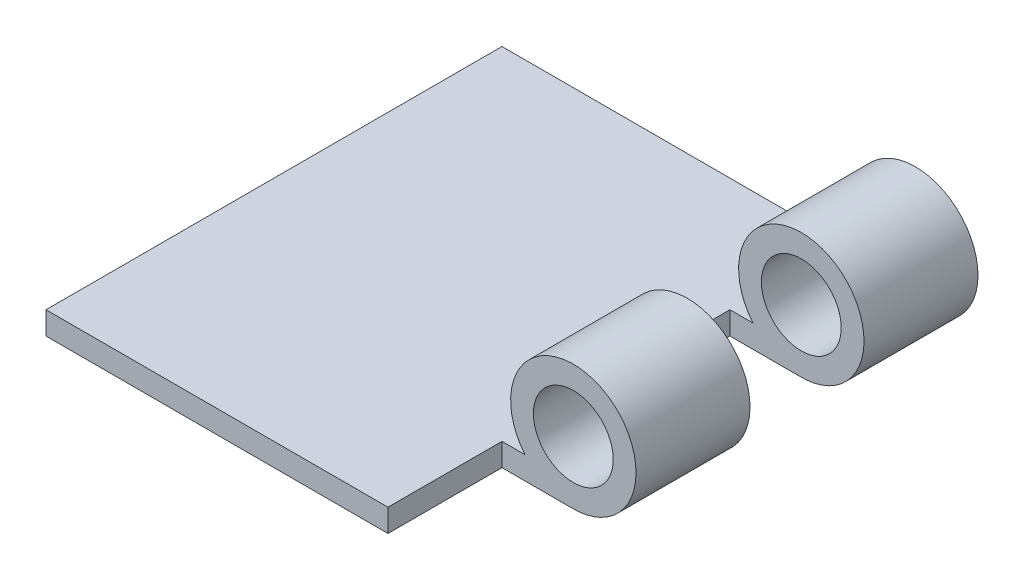
ISO-10303-21;
HEADER;
FILE_DESCRIPTION(('STEP AP214'),'2;1');
FILE_NAME('part.step','',(''),(''),'','','');
FILE_SCHEMA(('AUTOMOTIVE_DESIGN { 1 0 10303 214 1 1 1 1 }'));
ENDSEC;
DATA;
#1=APPLICATION_CONTEXT('core data for automotive mechanical design processes');
#2=APPLICATION_PROTOCOL_DEFINITION('international standard','automotive_design',2000,#1);
#3=PRODUCT_CONTEXT('',#1,'mechanical');
#4=PRODUCT('Part','Part','',(#3));
#5=PRODUCT_RELATED_PRODUCT_CATEGORY('part','',(#4));
#6=PRODUCT_DEFINITION_FORMATION('','',#4);
#7=PRODUCT_DEFINITION_CONTEXT('part definition',#1,'design');
#8=PRODUCT_DEFINITION('design','',#6,#7);
#9=PRODUCT_DEFINITION_SHAPE('','',#8);
#10=(LENGTH_UNIT() NAMED_UNIT(*) SI_UNIT(.MILLI.,.METRE.));
#11=(NAMED_UNIT(*) PLANE_ANGLE_UNIT() SI_UNIT($,.RADIAN.));
#12=(NAMED_UNIT(*) SI_UNIT($,.STERADIAN.) SOLID_ANGLE_UNIT());
#13=UNCERTAINTY_MEASURE_WITH_UNIT(LENGTH_MEASURE(1.E-05),#10,'distance_accuracy_value','');
#14=(GEOMETRIC_REPRESENTATION_CONTEXT(3) GLOBAL_UNCERTAINTY_ASSIGNED_CONTEXT((#13)) GLOBAL_UNIT_ASSIGNED_CONTEXT((#10,
#11,#12)) REPRESENTATION_CONTEXT('',''));
#15=CARTESIAN_POINT('',(0.,0.,0.));
#16=DIRECTION('',(0.,0.,1.));
#17=DIRECTION('',(1.,0.,0.));
#18=AXIS2_PLACEMENT_3D('',#15,#16,#17);
#19=CARTESIAN_POINT('',(0.,-1.,-10.));
#20=DIRECTION('',(0.,0.,1.));
#21=DIRECTION('',(1.,0.,0.));
#22=AXIS2_PLACEMENT_3D('',#19,#20,#21);
#23=PLANE('',#22);
#24=DIRECTION('',(1.,0.,0.));
#25=VECTOR('',#24,1.);
#26=CARTESIAN_POINT('',(0.,0.,-10.));
#27=LINE('',#26,#25);
#28=CARTESIAN_POINT('',(0.,0.,-10.));
#29=VERTEX_POINT('',#28);
#30=CARTESIAN_POINT('',(16.0088343607918,0.,-10.));
#31=VERTEX_POINT('',#30);
#32=EDGE_CURVE('E170',#29,#31,#27,.T.);
#33=ORIENTED_EDGE('',*,*,#32,.T.);
#34=CARTESIAN_POINT('',(18.1301547043514,1.75,-10.));
#35=DIRECTION('',(0.,0.,-1.));
#36=DIRECTION('',(-1.,0.,0.));
#37=AXIS2_PLACEMENT_3D('',#34,#35,#36);
#38=CIRCLE('',#37,2.75);
#39=CARTESIAN_POINT('',(18.,-0.996918228294245,-10.));
#40=VERTEX_POINT('',#39);
#41=EDGE_CURVE('E179',#31,#40,#38,.T.);
#42=ORIENTED_EDGE('',*,*,#41,.T.);
#43=DIRECTION('',(0.,1.,0.));
#44=VECTOR('',#43,1.);
#45=CARTESIAN_POINT('',(18.,-1.,-10.));
#46=LINE('',#45,#44);
#47=CARTESIAN_POINT('',(18.,-1.,-10.));
#48=VERTEX_POINT('',#47);
#49=EDGE_CURVE('E161',#48,#40,#46,.T.);
#50=ORIENTED_EDGE('',*,*,#49,.F.);
#51=DIRECTION('',(1.,0.,0.));
#52=VECTOR('',#51,1.);
#53=CARTESIAN_POINT('',(0.,-1.,-10.));
#54=LINE('',#53,#52);
#55=CARTESIAN_POINT('',(0.,-1.,-10.));
#56=VERTEX_POINT('',#55);
#57=EDGE_CURVE('E206',#56,#48,#54,.T.);
#58=ORIENTED_EDGE('',*,*,#57,.F.);
#59=DIRECTION('',(0.,1.,0.));
#60=VECTOR('',#59,1.);
#61=CARTESIAN_POINT('',(0.,-1.,-10.));
#62=LINE('',#61,#60);
#63=EDGE_CURVE('E181',#56,#29,#62,.T.);
#64=ORIENTED_EDGE('',*,*,#63,.T.);
#65=EDGE_LOOP('',(#33,#42,#50,#58,#64));
#66=FACE_BOUND('',#65,.T.);
#67=CARTESIAN_POINT('',(18.1301547043514,1.75,-10.));
#68=DIRECTION('',(0.,0.,-1.));
#69=DIRECTION('',(-1.,0.,0.));
#70=AXIS2_PLACEMENT_3D('',#67,#68,#69);
#71=CIRCLE('',#70,1.75);
#72=CARTESIAN_POINT('',(16.3801547043514,1.75,-10.));
#73=VERTEX_POINT('',#72);
#74=EDGE_CURVE('E139',#73,#73,#71,.T.);
#75=ORIENTED_EDGE('',*,*,#74,.F.);
#76=EDGE_LOOP('',(#75));
#77=FACE_BOUND('',#76,.T.);
#78=ADVANCED_FACE('F36',(#66,#77),#23,.F.);
#79=CARTESIAN_POINT('',(18.,-1.,-10.));
#80=DIRECTION('',(-1.,0.,0.));
#81=DIRECTION('',(0.,0.,1.));
#82=AXIS2_PLACEMENT_3D('',#79,#80,#81);
#83=PLANE('',#82);
#84=ORIENTED_EDGE('',*,*,#49,.T.);
#85=DIRECTION('',(0.,0.,-1.));
#86=VECTOR('',#85,1.);
#87=CARTESIAN_POINT('',(18.,-0.996918228294245,2.77817459305202));
#88=LINE('',#87,#86);
#89=CARTESIAN_POINT('',(18.,-0.996918228294245,-5.));
#90=VERTEX_POINT('',#89);
#91=EDGE_CURVE('E182',#40,#90,#88,.F.);
#92=ORIENTED_EDGE('',*,*,#91,.T.);
#93=DIRECTION('',(0.,1.,0.));
#94=VECTOR('',#93,1.);
#95=CARTESIAN_POINT('',(18.,-1.,-5.));
#96=LINE('',#95,#94);
#97=CARTESIAN_POINT('',(18.,-1.,-5.));
#98=VERTEX_POINT('',#97);
#99=EDGE_CURVE('E159',#98,#90,#96,.T.);
#100=ORIENTED_EDGE('',*,*,#99,.F.);
#101=DIRECTION('',(0.,0.,1.));
#102=VECTOR('',#101,1.);
#103=CARTESIAN_POINT('',(18.,-1.,-10.));
#104=LINE('',#103,#102);
#105=EDGE_CURVE('E238',#48,#98,#104,.T.);
#106=ORIENTED_EDGE('',*,*,#105,.F.);
#107=EDGE_LOOP('',(#84,#92,#100,#106));
#108=FACE_BOUND('',#107,.T.);
#109=ADVANCED_FACE('F270',(#108),#83,.F.);
#110=CARTESIAN_POINT('',(18.,-1.,-5.));
#111=DIRECTION('',(0.,0.,-1.));
#112=DIRECTION('',(-1.,0.,0.));
#113=AXIS2_PLACEMENT_3D('',#110,#111,#112);
#114=PLANE('',#113);
#115=ORIENTED_EDGE('',*,*,#99,.T.);
#116=CARTESIAN_POINT('',(18.1301547043514,1.75,-5.));
#117=DIRECTION('',(0.,0.,-1.));
#118=DIRECTION('',(-1.,0.,0.));
#119=AXIS2_PLACEMENT_3D('',#116,#117,#118);
#120=CIRCLE('',#119,2.75);
#121=CARTESIAN_POINT('',(16.0088343607918,0.,-5.));
#122=VERTEX_POINT('',#121);
#123=EDGE_CURVE('E58',#90,#122,#120,.F.);
#124=ORIENTED_EDGE('',*,*,#123,.T.);
#125=DIRECTION('',(-1.,0.,0.));
#126=VECTOR('',#125,1.);
#127=CARTESIAN_POINT('',(18.,0.,-5.));
#128=LINE('',#127,#126);
#129=CARTESIAN_POINT('',(15.,0.,-5.));
#130=VERTEX_POINT('',#129);
#131=EDGE_CURVE('E173',#122,#130,#128,.T.);
#132=ORIENTED_EDGE('',*,*,#131,.T.);
#133=DIRECTION('',(0.,1.,0.));
#134=VECTOR('',#133,1.);
#135=CARTESIAN_POINT('',(15.,-1.,-5.));
#136=LINE('',#135,#134);
#137=CARTESIAN_POINT('',(15.,-1.,-5.));
#138=VERTEX_POINT('',#137);
#139=EDGE_CURVE('E156',#138,#130,#136,.T.);
#140=ORIENTED_EDGE('',*,*,#139,.F.);
#141=DIRECTION('',(-1.,0.,0.));
#142=VECTOR('',#141,1.);
#143=CARTESIAN_POINT('',(18.,-1.,-5.));
#144=LINE('',#143,#142);
#145=EDGE_CURVE('E236',#98,#138,#144,.T.);
#146=ORIENTED_EDGE('',*,*,#145,.F.);
#147=EDGE_LOOP('',(#115,#124,#132,#140,#146));
#148=FACE_BOUND('',#147,.T.);
#149=CARTESIAN_POINT('',(18.1301547043514,1.75,-5.));
#150=DIRECTION('',(0.,0.,-1.));
#151=DIRECTION('',(-1.,0.,0.));
#152=AXIS2_PLACEMENT_3D('',#149,#150,#151);
#153=CIRCLE('',#152,1.75);
#154=CARTESIAN_POINT('',(16.3801547043514,1.75,-5.));
#155=VERTEX_POINT('',#154);
#156=EDGE_CURVE('E187',#155,#155,#153,.F.);
#157=ORIENTED_EDGE('',*,*,#156,.F.);
#158=EDGE_LOOP('',(#157));
#159=FACE_BOUND('',#158,.T.);
#160=ADVANCED_FACE('F266',(#148,#159),#114,.F.);
#161=CARTESIAN_POINT('',(15.,-1.,-5.));
#162=DIRECTION('',(-1.,0.,0.));
#163=DIRECTION('',(0.,0.,1.));
#164=AXIS2_PLACEMENT_3D('',#161,#162,#163);
#165=PLANE('',#164);
#166=DIRECTION('',(0.,0.,1.));
#167=VECTOR('',#166,1.);
#168=CARTESIAN_POINT('',(15.,0.,-5.));
#169=LINE('',#168,#167);
#170=CARTESIAN_POINT('',(15.,0.,0.));
#171=VERTEX_POINT('',#170);
#172=EDGE_CURVE('E184',#130,#171,#169,.T.);
#173=ORIENTED_EDGE('',*,*,#172,.T.);
#174=DIRECTION('',(0.,1.,0.));
#175=VECTOR('',#174,1.);
#176=CARTESIAN_POINT('',(15.,-1.,0.));
#177=LINE('',#176,#175);
#178=CARTESIAN_POINT('',(15.,-1.,0.));
#179=VERTEX_POINT('',#178);
#180=EDGE_CURVE('E147',#179,#171,#177,.T.);
#181=ORIENTED_EDGE('',*,*,#180,.F.);
#182=DIRECTION('',(0.,0.,1.));
#183=VECTOR('',#182,1.);
#184=CARTESIAN_POINT('',(15.,-1.,-5.));
#185=LINE('',#184,#183);
#186=EDGE_CURVE('E234',#138,#179,#185,.T.);
#187=ORIENTED_EDGE('',*,*,#186,.F.);
#188=ORIENTED_EDGE('',*,*,#139,.T.);
#189=EDGE_LOOP('',(#173,#181,#187,#188));
#190=FACE_BOUND('',#189,.T.);
#191=ADVANCED_FACE('F258',(#190),#165,.F.);
#192=CARTESIAN_POINT('',(15.,-1.,0.));
#193=DIRECTION('',(0.,0.,1.));
#194=DIRECTION('',(1.,0.,0.));
#195=AXIS2_PLACEMENT_3D('',#192,#193,#194);
#196=PLANE('',#195);
#197=DIRECTION('',(1.,0.,0.));
#198=VECTOR('',#197,1.);
#199=CARTESIAN_POINT('',(15.,0.,0.));
#200=LINE('',#199,#198);
#201=CARTESIAN_POINT('',(16.0088343607918,0.,0.));
#202=VERTEX_POINT('',#201);
#203=EDGE_CURVE('E194',#171,#202,#200,.T.);
#204=ORIENTED_EDGE('',*,*,#203,.T.);
#205=CARTESIAN_POINT('',(18.1301547043514,1.75,0.));
#206=DIRECTION('',(0.,0.,-1.));
#207=DIRECTION('',(-1.,0.,0.));
#208=AXIS2_PLACEMENT_3D('',#205,#206,#207);
#209=CIRCLE('',#208,2.75);
#210=CARTESIAN_POINT('',(18.,-0.996918228294247,0.));
#211=VERTEX_POINT('',#210);
#212=EDGE_CURVE('E128',#202,#211,#209,.T.);
#213=ORIENTED_EDGE('',*,*,#212,.T.);
#214=DIRECTION('',(0.,1.,0.));
#215=VECTOR('',#214,1.);
#216=CARTESIAN_POINT('',(18.,-1.,0.));
#217=LINE('',#216,#215);
#218=CARTESIAN_POINT('',(18.,-1.,0.));
#219=VERTEX_POINT('',#218);
#220=EDGE_CURVE('E138',#219,#211,#217,.T.);
#221=ORIENTED_EDGE('',*,*,#220,.F.);
#222=DIRECTION('',(1.,0.,0.));
#223=VECTOR('',#222,1.);
#224=CARTESIAN_POINT('',(15.,-1.,0.));
#225=LINE('',#224,#223);
#226=EDGE_CURVE('E232',#179,#219,#225,.T.);
#227=ORIENTED_EDGE('',*,*,#226,.F.);
#228=ORIENTED_EDGE('',*,*,#180,.T.);
#229=EDGE_LOOP('',(#204,#213,#221,#227,#228));
#230=FACE_BOUND('',#229,.T.);
#231=CARTESIAN_POINT('',(18.1301547043514,1.75,0.));
#232=DIRECTION('',(0.,0.,-1.));
#233=DIRECTION('',(-1.,0.,0.));
#234=AXIS2_PLACEMENT_3D('',#231,#232,#233);
#235=CIRCLE('',#234,1.75);
#236=CARTESIAN_POINT('',(16.3801547043514,1.75,0.));
#237=VERTEX_POINT('',#236);
#238=EDGE_CURVE('E250',#237,#237,#235,.T.);
#239=ORIENTED_EDGE('',*,*,#238,.F.);
#240=EDGE_LOOP('',(#239));
#241=FACE_BOUND('',#240,.T.);
#242=ADVANCED_FACE('F256',(#230,#241),#196,.F.);
#243=CARTESIAN_POINT('',(18.,-1.,0.));
#244=DIRECTION('',(-1.,0.,0.));
#245=DIRECTION('',(0.,0.,1.));
#246=AXIS2_PLACEMENT_3D('',#243,#244,#245);
#247=PLANE('',#246);
#248=ORIENTED_EDGE('',*,*,#220,.T.);
#249=DIRECTION('',(0.,0.,-1.));
#250=VECTOR('',#249,1.);
#251=CARTESIAN_POINT('',(18.,-0.996918228294248,12.778174593052));
#252=LINE('',#251,#250);
#253=CARTESIAN_POINT('',(18.,-0.996918228294247,5.));
#254=VERTEX_POINT('',#253);
#255=EDGE_CURVE('E124',#211,#254,#252,.F.);
#256=ORIENTED_EDGE('',*,*,#255,.T.);
#257=DIRECTION('',(0.,1.,0.));
#258=VECTOR('',#257,1.);
#259=CARTESIAN_POINT('',(18.,-1.,5.));
#260=LINE('',#259,#258);
#261=CARTESIAN_POINT('',(18.,-1.,5.));
#262=VERTEX_POINT('',#261);
#263=EDGE_CURVE('E135',#262,#254,#260,.T.);
#264=ORIENTED_EDGE('',*,*,#263,.F.);
#265=DIRECTION('',(0.,0.,1.));
#266=VECTOR('',#265,1.);
#267=CARTESIAN_POINT('',(18.,-1.,0.));
#268=LINE('',#267,#266);
#269=EDGE_CURVE('E230',#219,#262,#268,.T.);
#270=ORIENTED_EDGE('',*,*,#269,.F.);
#271=EDGE_LOOP('',(#248,#256,#264,#270));
#272=FACE_BOUND('',#271,.T.);
#273=ADVANCED_FACE('F133',(#272),#247,.F.);
#274=CARTESIAN_POINT('',(18.,-1.,5.));
#275=DIRECTION('',(0.,0.,-1.));
#276=DIRECTION('',(-1.,0.,0.));
#277=AXIS2_PLACEMENT_3D('',#274,#275,#276);
#278=PLANE('',#277);
#279=ORIENTED_EDGE('',*,*,#263,.T.);
#280=CARTESIAN_POINT('',(18.1301547043514,1.75,5.));
#281=DIRECTION('',(0.,0.,-1.));
#282=DIRECTION('',(-1.,0.,0.));
#283=AXIS2_PLACEMENT_3D('',#280,#281,#282);
#284=CIRCLE('',#283,2.75);
#285=CARTESIAN_POINT('',(16.0088343607918,0.,5.));
#286=VERTEX_POINT('',#285);
#287=EDGE_CURVE('E50',#254,#286,#284,.F.);
#288=ORIENTED_EDGE('',*,*,#287,.T.);
#289=DIRECTION('',(-1.,0.,0.));
#290=VECTOR('',#289,1.);
#291=CARTESIAN_POINT('',(18.,0.,5.));
#292=LINE('',#291,#290);
#293=CARTESIAN_POINT('',(15.,0.,5.));
#294=VERTEX_POINT('',#293);
#295=EDGE_CURVE('E197',#286,#294,#292,.T.);
#296=ORIENTED_EDGE('',*,*,#295,.T.);
#297=DIRECTION('',(0.,1.,0.));
#298=VECTOR('',#297,1.);
#299=CARTESIAN_POINT('',(15.,-1.,5.));
#300=LINE('',#299,#298);
#301=CARTESIAN_POINT('',(15.,-1.,5.));
#302=VERTEX_POINT('',#301);
#303=EDGE_CURVE('E145',#302,#294,#300,.T.);
#304=ORIENTED_EDGE('',*,*,#303,.F.);
#305=DIRECTION('',(-1.,0.,0.));
#306=VECTOR('',#305,1.);
#307=CARTESIAN_POINT('',(18.,-1.,5.));
#308=LINE('',#307,#306);
#309=EDGE_CURVE('E144',#262,#302,#308,.T.);
#310=ORIENTED_EDGE('',*,*,#309,.F.);
#311=EDGE_LOOP('',(#279,#288,#296,#304,#310));
#312=FACE_BOUND('',#311,.T.);
#313=CARTESIAN_POINT('',(18.1301547043514,1.75,5.));
#314=DIRECTION('',(0.,0.,-1.));
#315=DIRECTION('',(-1.,0.,0.));
#316=AXIS2_PLACEMENT_3D('',#313,#314,#315);
#317=CIRCLE('',#316,1.75);
#318=CARTESIAN_POINT('',(16.3801547043514,1.75,5.));
#319=VERTEX_POINT('',#318);
#320=EDGE_CURVE('E127',#319,#319,#317,.F.);
#321=ORIENTED_EDGE('',*,*,#320,.F.);
#322=EDGE_LOOP('',(#321));
#323=FACE_BOUND('',#322,.T.);
#324=ADVANCED_FACE('F141',(#312,#323),#278,.F.);
#325=CARTESIAN_POINT('',(15.,-1.,5.));
#326=DIRECTION('',(-1.,0.,0.));
#327=DIRECTION('',(0.,0.,1.));
#328=AXIS2_PLACEMENT_3D('',#325,#326,#327);
#329=PLANE('',#328);
#330=DIRECTION('',(0.,0.,1.));
#331=VECTOR('',#330,1.);
#332=CARTESIAN_POINT('',(15.,0.,5.));
#333=LINE('',#332,#331);
#334=CARTESIAN_POINT('',(15.,0.,10.));
#335=VERTEX_POINT('',#334);
#336=EDGE_CURVE('E199',#294,#335,#333,.T.);
#337=ORIENTED_EDGE('',*,*,#336,.T.);
#338=DIRECTION('',(0.,1.,0.));
#339=VECTOR('',#338,1.);
#340=CARTESIAN_POINT('',(15.,-1.,10.));
#341=LINE('',#340,#339);
#342=CARTESIAN_POINT('',(15.,-1.,10.));
#343=VERTEX_POINT('',#342);
#344=EDGE_CURVE('E150',#343,#335,#341,.T.);
#345=ORIENTED_EDGE('',*,*,#344,.F.);
#346=DIRECTION('',(0.,0.,1.));
#347=VECTOR('',#346,1.);
#348=CARTESIAN_POINT('',(15.,-1.,5.));
#349=LINE('',#348,#347);
#350=EDGE_CURVE('E226',#302,#343,#349,.T.);
#351=ORIENTED_EDGE('',*,*,#350,.F.);
#352=ORIENTED_EDGE('',*,*,#303,.T.);
#353=EDGE_LOOP('',(#337,#345,#351,#352));
#354=FACE_BOUND('',#353,.T.);
#355=ADVANCED_FACE('F288',(#354),#329,.F.);
#356=CARTESIAN_POINT('',(15.,-1.,10.));
#357=DIRECTION('',(0.,0.,-1.));
#358=DIRECTION('',(-1.,0.,0.));
#359=AXIS2_PLACEMENT_3D('',#356,#357,#358);
#360=PLANE('',#359);
#361=DIRECTION('',(-1.,0.,0.));
#362=VECTOR('',#361,1.);
#363=CARTESIAN_POINT('',(15.,0.,10.));
#364=LINE('',#363,#362);
#365=CARTESIAN_POINT('',(0.,0.,10.));
#366=VERTEX_POINT('',#365);
#367=EDGE_CURVE('E201',#335,#366,#364,.T.);
#368=ORIENTED_EDGE('',*,*,#367,.T.);
#369=DIRECTION('',(0.,1.,0.));
#370=VECTOR('',#369,1.);
#371=CARTESIAN_POINT('',(0.,-1.,10.));
#372=LINE('',#371,#370);
#373=CARTESIAN_POINT('',(0.,-1.,10.));
#374=VERTEX_POINT('',#373);
#375=EDGE_CURVE('E208',#374,#366,#372,.T.);
#376=ORIENTED_EDGE('',*,*,#375,.F.);
#377=DIRECTION('',(-1.,0.,0.));
#378=VECTOR('',#377,1.);
#379=CARTESIAN_POINT('',(15.,-1.,10.));
#380=LINE('',#379,#378);
#381=EDGE_CURVE('E216',#343,#374,#380,.T.);
#382=ORIENTED_EDGE('',*,*,#381,.F.);
#383=ORIENTED_EDGE('',*,*,#344,.T.);
#384=EDGE_LOOP('',(#368,#376,#382,#383));
#385=FACE_BOUND('',#384,.T.);
#386=ADVANCED_FACE('F214',(#385),#360,.F.);
#387=CARTESIAN_POINT('',(0.,-1.,-10.));
#388=DIRECTION('',(-1.,0.,0.));
#389=DIRECTION('',(0.,0.,1.));
#390=AXIS2_PLACEMENT_3D('',#387,#388,#389);
#391=PLANE('',#390);
#392=DIRECTION('',(0.,0.,1.));
#393=VECTOR('',#392,1.);
#394=CARTESIAN_POINT('',(0.,0.,-10.));
#395=LINE('',#394,#393);
#396=EDGE_CURVE('E204',#29,#366,#395,.T.);
#397=ORIENTED_EDGE('',*,*,#396,.F.);
#398=ORIENTED_EDGE('',*,*,#63,.F.);
#399=DIRECTION('',(0.,0.,1.));
#400=VECTOR('',#399,1.);
#401=CARTESIAN_POINT('',(0.,-1.,-10.));
#402=LINE('',#401,#400);
#403=EDGE_CURVE('E190',#56,#374,#402,.T.);
#404=ORIENTED_EDGE('',*,*,#403,.T.);
#405=ORIENTED_EDGE('',*,*,#375,.T.);
#406=EDGE_LOOP('',(#397,#398,#404,#405));
#407=FACE_BOUND('',#406,.T.);
#408=ADVANCED_FACE('F221',(#407),#391,.T.);
#409=CARTESIAN_POINT('',(0.,-1.,0.));
#410=DIRECTION('',(0.,-1.,0.));
#411=DIRECTION('',(0.,0.,-1.));
#412=AXIS2_PLACEMENT_3D('',#409,#410,#411);
#413=PLANE('',#412);
#414=ORIENTED_EDGE('',*,*,#57,.T.);
#415=ORIENTED_EDGE('',*,*,#105,.T.);
#416=ORIENTED_EDGE('',*,*,#145,.T.);
#417=ORIENTED_EDGE('',*,*,#186,.T.);
#418=ORIENTED_EDGE('',*,*,#226,.T.);
#419=ORIENTED_EDGE('',*,*,#269,.T.);
#420=ORIENTED_EDGE('',*,*,#309,.T.);
#421=ORIENTED_EDGE('',*,*,#350,.T.);
#422=ORIENTED_EDGE('',*,*,#381,.T.);
#423=ORIENTED_EDGE('',*,*,#403,.F.);
#424=EDGE_LOOP('',(#414,#415,#416,#417,#418,#419,#420,#421,#422,#423));
#425=FACE_BOUND('',#424,.T.);
#426=ADVANCED_FACE('F280',(#425),#413,.T.);
#427=CARTESIAN_POINT('',(0.,0.,0.));
#428=DIRECTION('',(0.,-1.,0.));
#429=DIRECTION('',(0.,0.,-1.));
#430=AXIS2_PLACEMENT_3D('',#427,#428,#429);
#431=PLANE('',#430);
#432=ORIENTED_EDGE('',*,*,#295,.F.);
#433=DIRECTION('',(0.,0.,-1.));
#434=VECTOR('',#433,1.);
#435=CARTESIAN_POINT('',(16.0088343607918,0.,12.778174593052));
#436=LINE('',#435,#434);
#437=EDGE_CURVE('E11',#286,#202,#436,.T.);
#438=ORIENTED_EDGE('',*,*,#437,.T.);
#439=ORIENTED_EDGE('',*,*,#203,.F.);
#440=ORIENTED_EDGE('',*,*,#172,.F.);
#441=ORIENTED_EDGE('',*,*,#131,.F.);
#442=DIRECTION('',(0.,0.,-1.));
#443=VECTOR('',#442,1.);
#444=CARTESIAN_POINT('',(16.0088343607918,0.,2.77817459305202));
#445=LINE('',#444,#443);
#446=EDGE_CURVE('E43',#122,#31,#445,.T.);
#447=ORIENTED_EDGE('',*,*,#446,.T.);
#448=ORIENTED_EDGE('',*,*,#32,.F.);
#449=ORIENTED_EDGE('',*,*,#396,.T.);
#450=ORIENTED_EDGE('',*,*,#367,.F.);
#451=ORIENTED_EDGE('',*,*,#336,.F.);
#452=EDGE_LOOP('',(#432,#438,#439,#440,#441,#447,#448,#449,#450,#451));
#453=FACE_BOUND('',#452,.T.);
#454=ADVANCED_FACE('F168',(#453),#431,.F.);
#455=CARTESIAN_POINT('',(18.1301547043514,1.75,2.77817459305202));
#456=DIRECTION('',(0.,0.,-1.));
#457=DIRECTION('',(-1.,0.,0.));
#458=AXIS2_PLACEMENT_3D('',#455,#456,#457);
#459=CYLINDRICAL_SURFACE('',#458,2.75);
#460=ORIENTED_EDGE('',*,*,#91,.F.);
#461=ORIENTED_EDGE('',*,*,#41,.F.);
#462=ORIENTED_EDGE('',*,*,#446,.F.);
#463=ORIENTED_EDGE('',*,*,#123,.F.);
#464=EDGE_LOOP('',(#460,#461,#462,#463));
#465=FACE_BOUND('',#464,.T.);
#466=ADVANCED_FACE('F302',(#465),#459,.T.);
#467=CARTESIAN_POINT('',(18.1301547043514,1.75,2.77817459305202));
#468=DIRECTION('',(0.,0.,-1.));
#469=DIRECTION('',(-1.,0.,0.));
#470=AXIS2_PLACEMENT_3D('',#467,#468,#469);
#471=CYLINDRICAL_SURFACE('',#470,1.75);
#472=ORIENTED_EDGE('',*,*,#156,.T.);
#473=EDGE_LOOP('',(#472));
#474=FACE_BOUND('',#473,.T.);
#475=ORIENTED_EDGE('',*,*,#74,.T.);
#476=EDGE_LOOP('',(#475));
#477=FACE_BOUND('',#476,.T.);
#478=ADVANCED_FACE('F307',(#474,#477),#471,.F.);
#479=CARTESIAN_POINT('',(18.1301547043514,1.75,12.778174593052));
#480=DIRECTION('',(0.,0.,-1.));
#481=DIRECTION('',(-1.,0.,0.));
#482=AXIS2_PLACEMENT_3D('',#479,#480,#481);
#483=CYLINDRICAL_SURFACE('',#482,2.75);
#484=ORIENTED_EDGE('',*,*,#255,.F.);
#485=ORIENTED_EDGE('',*,*,#212,.F.);
#486=ORIENTED_EDGE('',*,*,#437,.F.);
#487=ORIENTED_EDGE('',*,*,#287,.F.);
#488=EDGE_LOOP('',(#484,#485,#486,#487));
#489=FACE_BOUND('',#488,.T.);
#490=ADVANCED_FACE('F123',(#489),#483,.T.);
#491=CARTESIAN_POINT('',(18.1301547043514,1.75,12.778174593052));
#492=DIRECTION('',(0.,0.,-1.));
#493=DIRECTION('',(-1.,0.,0.));
#494=AXIS2_PLACEMENT_3D('',#491,#492,#493);
#495=CYLINDRICAL_SURFACE('',#494,1.75);
#496=ORIENTED_EDGE('',*,*,#320,.T.);
#497=EDGE_LOOP('',(#496));
#498=FACE_BOUND('',#497,.T.);
#499=ORIENTED_EDGE('',*,*,#238,.T.);
#500=EDGE_LOOP('',(#499));
#501=FACE_BOUND('',#500,.T.);
#502=ADVANCED_FACE('F254',(#498,#501),#495,.F.);
#503=CLOSED_SHELL('',(#78,#109,#160,#191,#242,#273,#324,#355,#386,#408,#426,#454,#466,#478,#490,#502));
#504=MANIFOLD_SOLID_BREP('B2',#503);
#505=ADVANCED_BREP_SHAPE_REPRESENTATION('',(#18,#504),#14);
#506=SHAPE_DEFINITION_REPRESENTATION(#9,#505);
ENDSEC;
END-ISO-10303-21;
